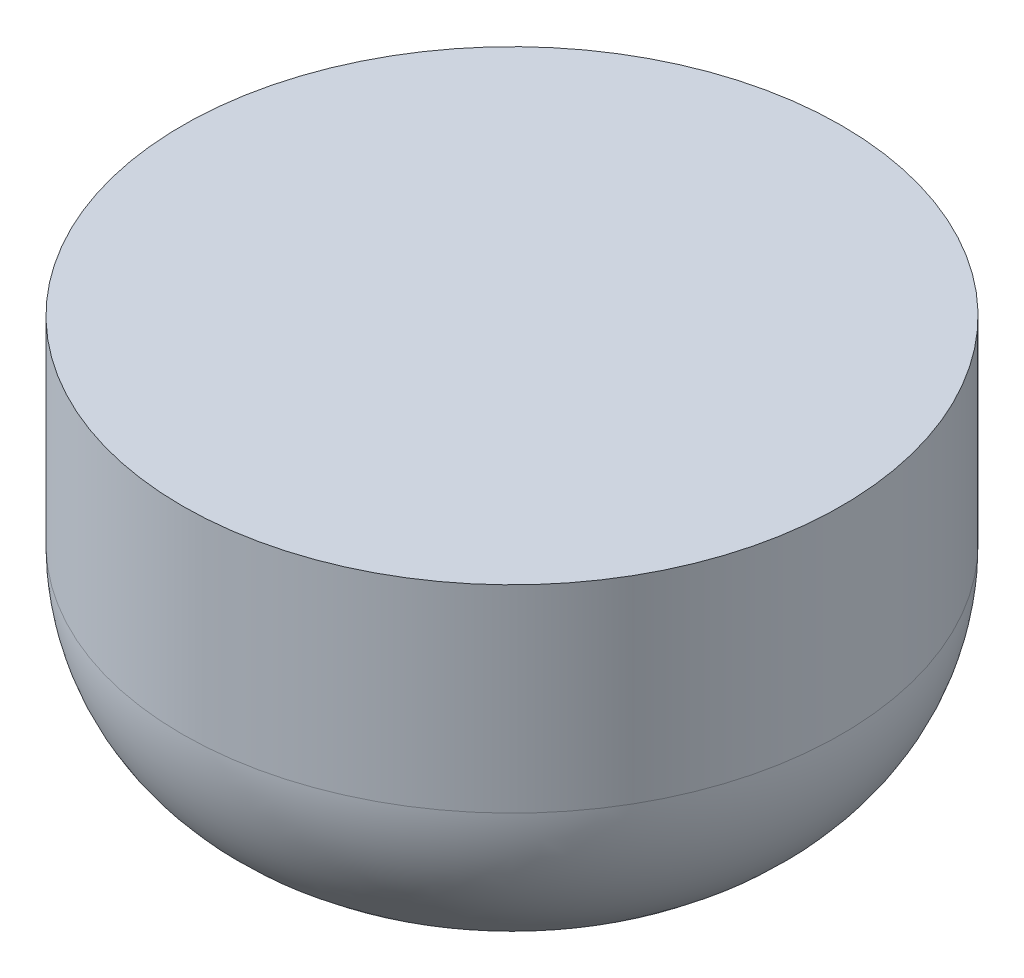
ISO-10303-21;
HEADER;
FILE_DESCRIPTION(('STEP AP214'),'2;1');
FILE_NAME('part.step','',(''),(''),'','','');
FILE_SCHEMA(('AUTOMOTIVE_DESIGN { 1 0 10303 214 1 1 1 1 }'));
ENDSEC;
DATA;
#1=APPLICATION_CONTEXT('core data for automotive mechanical design processes');
#2=APPLICATION_PROTOCOL_DEFINITION('international standard','automotive_design',2000,#1);
#3=PRODUCT_CONTEXT('',#1,'mechanical');
#4=PRODUCT('Part','Part','',(#3));
#5=PRODUCT_RELATED_PRODUCT_CATEGORY('part','',(#4));
#6=PRODUCT_DEFINITION_FORMATION('','',#4);
#7=PRODUCT_DEFINITION_CONTEXT('part definition',#1,'design');
#8=PRODUCT_DEFINITION('design','',#6,#7);
#9=PRODUCT_DEFINITION_SHAPE('','',#8);
#10=(LENGTH_UNIT() NAMED_UNIT(*) SI_UNIT(.MILLI.,.METRE.));
#11=(NAMED_UNIT(*) PLANE_ANGLE_UNIT() SI_UNIT($,.RADIAN.));
#12=(NAMED_UNIT(*) SI_UNIT($,.STERADIAN.) SOLID_ANGLE_UNIT());
#13=UNCERTAINTY_MEASURE_WITH_UNIT(LENGTH_MEASURE(1.E-05),#10,'distance_accuracy_value','');
#14=(GEOMETRIC_REPRESENTATION_CONTEXT(3) GLOBAL_UNCERTAINTY_ASSIGNED_CONTEXT((#13)) GLOBAL_UNIT_ASSIGNED_CONTEXT((#10,
#11,#12)) REPRESENTATION_CONTEXT('',''));
#15=CARTESIAN_POINT('',(0.,0.,0.));
#16=DIRECTION('',(0.,0.,1.));
#17=DIRECTION('',(1.,0.,0.));
#18=AXIS2_PLACEMENT_3D('',#15,#16,#17);
#19=CARTESIAN_POINT('',(0.,3.,0.));
#20=DIRECTION('',(0.,-1.,0.));
#21=DIRECTION('',(0.,0.,-1.));
#22=AXIS2_PLACEMENT_3D('',#19,#20,#21);
#23=CYLINDRICAL_SURFACE('',#22,2.5);
#24=CARTESIAN_POINT('',(0.,1.5,0.));
#25=DIRECTION('',(0.,1.,0.));
#26=DIRECTION('',(0.,0.,1.));
#27=AXIS2_PLACEMENT_3D('',#24,#25,#26);
#28=CIRCLE('',#27,2.5);
#29=CARTESIAN_POINT('',(0.,1.5,2.5));
#30=VERTEX_POINT('',#29);
#31=EDGE_CURVE('E48',#30,#30,#28,.T.);
#32=ORIENTED_EDGE('',*,*,#31,.T.);
#33=EDGE_LOOP('',(#32));
#34=FACE_BOUND('',#33,.T.);
#35=CARTESIAN_POINT('',(0.,3.,0.));
#36=DIRECTION('',(0.,1.,0.));
#37=DIRECTION('',(0.,0.,1.));
#38=AXIS2_PLACEMENT_3D('',#35,#36,#37);
#39=CIRCLE('',#38,2.5);
#40=CARTESIAN_POINT('',(0.,3.,2.5));
#41=VERTEX_POINT('',#40);
#42=EDGE_CURVE('E52',#41,#41,#39,.T.);
#43=ORIENTED_EDGE('',*,*,#42,.F.);
#44=EDGE_LOOP('',(#43));
#45=FACE_BOUND('',#44,.T.);
#46=ADVANCED_FACE('F41',(#34,#45),#23,.T.);
#47=CARTESIAN_POINT('',(0.,3.,0.));
#48=DIRECTION('',(0.,1.,0.));
#49=DIRECTION('',(0.,0.,1.));
#50=AXIS2_PLACEMENT_3D('',#47,#48,#49);
#51=PLANE('',#50);
#52=ORIENTED_EDGE('',*,*,#42,.T.);
#53=EDGE_LOOP('',(#52));
#54=FACE_BOUND('',#53,.T.);
#55=ADVANCED_FACE('F59',(#54),#51,.T.);
#56=CARTESIAN_POINT('',(0.,0.,0.));
#57=DIRECTION('',(0.,1.,0.));
#58=DIRECTION('',(0.,0.,1.));
#59=AXIS2_PLACEMENT_3D('',#56,#57,#58);
#60=PLANE('',#59);
#61=CARTESIAN_POINT('',(0.,0.,0.));
#62=DIRECTION('',(0.,1.,0.));
#63=DIRECTION('',(0.,0.,1.));
#64=AXIS2_PLACEMENT_3D('',#61,#62,#63);
#65=CIRCLE('',#64,1.);
#66=CARTESIAN_POINT('',(0.,0.,1.));
#67=VERTEX_POINT('',#66);
#68=EDGE_CURVE('E10',#67,#67,#65,.F.);
#69=ORIENTED_EDGE('',*,*,#68,.T.);
#70=EDGE_LOOP('',(#69));
#71=FACE_BOUND('',#70,.T.);
#72=ADVANCED_FACE('F66',(#71),#60,.F.);
#73=CARTESIAN_POINT('',(0.,1.5,0.));
#74=DIRECTION('',(0.,1.,0.));
#75=DIRECTION('',(0.,0.,1.));
#76=AXIS2_PLACEMENT_3D('',#73,#74,#75);
#77=DEGENERATE_TOROIDAL_SURFACE('',#76,1.,1.5,.T.);
#78=ORIENTED_EDGE('',*,*,#68,.F.);
#79=EDGE_LOOP('',(#78));
#80=FACE_BOUND('',#79,.T.);
#81=ORIENTED_EDGE('',*,*,#31,.F.);
#82=EDGE_LOOP('',(#81));
#83=FACE_BOUND('',#82,.T.);
#84=ADVANCED_FACE('F43',(#80,#83),#77,.T.);
#85=CLOSED_SHELL('',(#46,#55,#72,#84));
#86=MANIFOLD_SOLID_BREP('B2',#85);
#87=ADVANCED_BREP_SHAPE_REPRESENTATION('',(#18,#86),#14);
#88=SHAPE_DEFINITION_REPRESENTATION(#9,#87);
ENDSEC;
END-ISO-10303-21;
